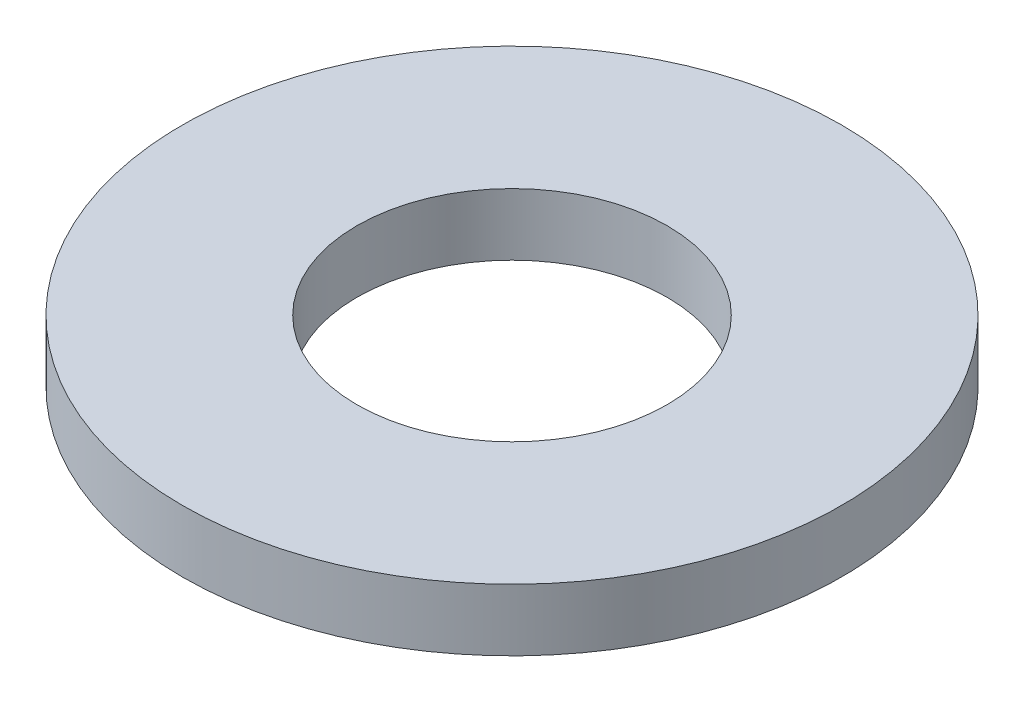
ISO-10303-21;
HEADER;
FILE_DESCRIPTION(('STEP AP214'),'2;1');
FILE_NAME('part.step','',(''),(''),'','','');
FILE_SCHEMA(('AUTOMOTIVE_DESIGN { 1 0 10303 214 1 1 1 1 }'));
ENDSEC;
DATA;
#1=APPLICATION_CONTEXT('core data for automotive mechanical design processes');
#2=APPLICATION_PROTOCOL_DEFINITION('international standard','automotive_design',2000,#1);
#3=PRODUCT_CONTEXT('',#1,'mechanical');
#4=PRODUCT('Part','Part','',(#3));
#5=PRODUCT_RELATED_PRODUCT_CATEGORY('part','',(#4));
#6=PRODUCT_DEFINITION_FORMATION('','',#4);
#7=PRODUCT_DEFINITION_CONTEXT('part definition',#1,'design');
#8=PRODUCT_DEFINITION('design','',#6,#7);
#9=PRODUCT_DEFINITION_SHAPE('','',#8);
#10=(LENGTH_UNIT() NAMED_UNIT(*) SI_UNIT(.MILLI.,.METRE.));
#11=(NAMED_UNIT(*) PLANE_ANGLE_UNIT() SI_UNIT($,.RADIAN.));
#12=(NAMED_UNIT(*) SI_UNIT($,.STERADIAN.) SOLID_ANGLE_UNIT());
#13=UNCERTAINTY_MEASURE_WITH_UNIT(LENGTH_MEASURE(1.E-05),#10,'distance_accuracy_value','');
#14=(GEOMETRIC_REPRESENTATION_CONTEXT(3) GLOBAL_UNCERTAINTY_ASSIGNED_CONTEXT((#13)) GLOBAL_UNIT_ASSIGNED_CONTEXT((#10,
#11,#12)) REPRESENTATION_CONTEXT('',''));
#15=CARTESIAN_POINT('',(0.,0.,0.));
#16=DIRECTION('',(0.,0.,1.));
#17=DIRECTION('',(1.,0.,0.));
#18=AXIS2_PLACEMENT_3D('',#15,#16,#17);
#19=CARTESIAN_POINT('',(0.,0.64,0.));
#20=DIRECTION('',(0.,1.,0.));
#21=DIRECTION('',(0.,0.,-1.));
#22=AXIS2_PLACEMENT_3D('',#19,#20,#21);
#23=PLANE('',#22);
#24=CARTESIAN_POINT('',(0.,0.64,0.));
#25=DIRECTION('',(0.,-1.,0.));
#26=DIRECTION('',(0.,0.,-1.));
#27=AXIS2_PLACEMENT_3D('',#24,#25,#26);
#28=CIRCLE('',#27,3.4);
#29=CARTESIAN_POINT('',(0.,0.64,3.4));
#30=VERTEX_POINT('',#29);
#31=EDGE_CURVE('E10',#30,#30,#28,.T.);
#32=ORIENTED_EDGE('',*,*,#31,.F.);
#33=EDGE_LOOP('',(#32));
#34=FACE_BOUND('',#33,.T.);
#35=CARTESIAN_POINT('',(0.,0.64,0.));
#36=DIRECTION('',(0.,-1.,0.));
#37=DIRECTION('',(0.,0.,-1.));
#38=AXIS2_PLACEMENT_3D('',#35,#36,#37);
#39=CIRCLE('',#38,1.6);
#40=CARTESIAN_POINT('',(0.,0.64,1.6));
#41=VERTEX_POINT('',#40);
#42=EDGE_CURVE('E50',#41,#41,#39,.T.);
#43=ORIENTED_EDGE('',*,*,#42,.T.);
#44=EDGE_LOOP('',(#43));
#45=FACE_BOUND('',#44,.T.);
#46=ADVANCED_FACE('F39',(#34,#45),#23,.T.);
#47=CARTESIAN_POINT('',(0.,0.,0.));
#48=DIRECTION('',(0.,1.,0.));
#49=DIRECTION('',(0.,0.,-1.));
#50=AXIS2_PLACEMENT_3D('',#47,#48,#49);
#51=PLANE('',#50);
#52=CARTESIAN_POINT('',(0.,0.,0.));
#53=DIRECTION('',(0.,-1.,0.));
#54=DIRECTION('',(0.,0.,-1.));
#55=AXIS2_PLACEMENT_3D('',#52,#53,#54);
#56=CIRCLE('',#55,3.4);
#57=CARTESIAN_POINT('',(0.,0.,3.4));
#58=VERTEX_POINT('',#57);
#59=EDGE_CURVE('E43',#58,#58,#56,.T.);
#60=ORIENTED_EDGE('',*,*,#59,.T.);
#61=EDGE_LOOP('',(#60));
#62=FACE_BOUND('',#61,.T.);
#63=CARTESIAN_POINT('',(0.,0.,0.));
#64=DIRECTION('',(0.,-1.,0.));
#65=DIRECTION('',(0.,0.,-1.));
#66=AXIS2_PLACEMENT_3D('',#63,#64,#65);
#67=CIRCLE('',#66,1.6);
#68=CARTESIAN_POINT('',(0.,0.,1.6));
#69=VERTEX_POINT('',#68);
#70=EDGE_CURVE('E52',#69,#69,#67,.T.);
#71=ORIENTED_EDGE('',*,*,#70,.F.);
#72=EDGE_LOOP('',(#71));
#73=FACE_BOUND('',#72,.T.);
#74=ADVANCED_FACE('F65',(#62,#73),#51,.F.);
#75=CARTESIAN_POINT('',(0.,0.64,0.));
#76=DIRECTION('',(0.,-1.,0.));
#77=DIRECTION('',(0.,0.,1.));
#78=AXIS2_PLACEMENT_3D('',#75,#76,#77);
#79=CYLINDRICAL_SURFACE('',#78,3.4);
#80=CARTESIAN_POINT('',(0.,0.64,3.4));
#81=CARTESIAN_POINT('',(0.,0.633333333333334,3.4));
#82=CARTESIAN_POINT('',(0.,0.626666666666667,3.4));
#83=CARTESIAN_POINT('',(0.,0.613333333333334,3.4));
#84=CARTESIAN_POINT('',(0.,0.606666666666667,3.4));
#85=CARTESIAN_POINT('',(0.,0.593333333333333,3.4));
#86=CARTESIAN_POINT('',(0.,0.586666666666667,3.4));
#87=CARTESIAN_POINT('',(0.,0.573333333333333,3.4));
#88=CARTESIAN_POINT('',(0.,0.566666666666667,3.4));
#89=CARTESIAN_POINT('',(0.,0.553333333333333,3.4));
#90=CARTESIAN_POINT('',(0.,0.546666666666667,3.4));
#91=CARTESIAN_POINT('',(0.,0.533333333333333,3.4));
#92=CARTESIAN_POINT('',(0.,0.526666666666667,3.4));
#93=CARTESIAN_POINT('',(0.,0.513333333333333,3.4));
#94=CARTESIAN_POINT('',(0.,0.506666666666667,3.4));
#95=CARTESIAN_POINT('',(0.,0.493333333333333,3.4));
#96=CARTESIAN_POINT('',(0.,0.486666666666667,3.4));
#97=CARTESIAN_POINT('',(0.,0.473333333333333,3.4));
#98=CARTESIAN_POINT('',(0.,0.466666666666667,3.4));
#99=CARTESIAN_POINT('',(0.,0.453333333333333,3.4));
#100=CARTESIAN_POINT('',(0.,0.446666666666667,3.4));
#101=CARTESIAN_POINT('',(0.,0.433333333333333,3.4));
#102=CARTESIAN_POINT('',(0.,0.426666666666667,3.4));
#103=CARTESIAN_POINT('',(0.,0.413333333333333,3.4));
#104=CARTESIAN_POINT('',(0.,0.406666666666667,3.4));
#105=CARTESIAN_POINT('',(0.,0.393333333333333,3.4));
#106=CARTESIAN_POINT('',(0.,0.386666666666667,3.4));
#107=CARTESIAN_POINT('',(0.,0.373333333333333,3.4));
#108=CARTESIAN_POINT('',(0.,0.366666666666667,3.4));
#109=CARTESIAN_POINT('',(0.,0.353333333333333,3.4));
#110=CARTESIAN_POINT('',(0.,0.346666666666667,3.4));
#111=CARTESIAN_POINT('',(0.,0.333333333333333,3.4));
#112=CARTESIAN_POINT('',(0.,0.326666666666667,3.4));
#113=CARTESIAN_POINT('',(0.,0.313333333333333,3.4));
#114=CARTESIAN_POINT('',(0.,0.306666666666667,3.4));
#115=CARTESIAN_POINT('',(0.,0.293333333333333,3.4));
#116=CARTESIAN_POINT('',(0.,0.286666666666667,3.4));
#117=CARTESIAN_POINT('',(0.,0.273333333333333,3.4));
#118=CARTESIAN_POINT('',(0.,0.266666666666667,3.4));
#119=CARTESIAN_POINT('',(0.,0.253333333333333,3.4));
#120=CARTESIAN_POINT('',(0.,0.246666666666667,3.4));
#121=CARTESIAN_POINT('',(0.,0.233333333333333,3.4));
#122=CARTESIAN_POINT('',(0.,0.226666666666667,3.4));
#123=CARTESIAN_POINT('',(0.,0.213333333333333,3.4));
#124=CARTESIAN_POINT('',(0.,0.206666666666667,3.4));
#125=CARTESIAN_POINT('',(0.,0.193333333333333,3.4));
#126=CARTESIAN_POINT('',(0.,0.186666666666667,3.4));
#127=CARTESIAN_POINT('',(0.,0.173333333333333,3.4));
#128=CARTESIAN_POINT('',(0.,0.166666666666667,3.4));
#129=CARTESIAN_POINT('',(0.,0.153333333333333,3.4));
#130=CARTESIAN_POINT('',(0.,0.146666666666667,3.4));
#131=CARTESIAN_POINT('',(0.,0.133333333333333,3.4));
#132=CARTESIAN_POINT('',(0.,0.126666666666667,3.4));
#133=CARTESIAN_POINT('',(0.,0.113333333333333,3.4));
#134=CARTESIAN_POINT('',(0.,0.106666666666667,3.4));
#135=CARTESIAN_POINT('',(0.,0.0933333333333334,3.4));
#136=CARTESIAN_POINT('',(0.,0.0866666666666667,3.4));
#137=CARTESIAN_POINT('',(0.,0.0733333333333333,3.4));
#138=CARTESIAN_POINT('',(0.,0.0666666666666667,3.4));
#139=CARTESIAN_POINT('',(0.,0.0533333333333334,3.4));
#140=CARTESIAN_POINT('',(0.,0.0466666666666667,3.4));
#141=CARTESIAN_POINT('',(0.,0.0333333333333333,3.4));
#142=CARTESIAN_POINT('',(0.,0.0266666666666667,3.4));
#143=CARTESIAN_POINT('',(0.,0.0133333333333334,3.4));
#144=CARTESIAN_POINT('',(0.,0.00666666666666668,3.4));
#145=CARTESIAN_POINT('',(0.,0.,3.4));
#146=B_SPLINE_CURVE_WITH_KNOTS('',3,(#80,#81,#82,#83,#84,#85,#86,#87,#88,#89,#90,#91,#92,#93,
#94,#95,#96,#97,#98,#99,#100,#101,#102,#103,#104,#105,#106,#107,#108,#109,#110,#111,#112,#113,
#114,#115,#116,#117,#118,#119,#120,#121,#122,#123,#124,#125,#126,#127,#128,#129,#130,#131,#132,
#133,#134,#135,#136,#137,#138,#139,#140,#141,#142,#143,#144,#145),.UNSPECIFIED.,.F.,.F.,(4,2,2,
2,2,2,2,2,2,2,2,2,2,2,2,2,2,2,2,2,2,2,2,2,2,2,2,2,2,2,2,2,4),(0.,0.0200000000000001,
0.0400000000000001,0.06,0.0800000000000001,0.1,0.12,0.14,0.16,0.18,0.2,0.22,0.24,0.26,0.28,0.3,
0.32,0.34,0.36,0.38,0.4,0.42,0.44,0.46,0.48,0.5,0.52,0.54,0.56,0.58,0.6,0.62,0.64),.UNSPECIFIED.);
#147=EDGE_CURVE('BSEAM41',#30,#58,#146,.T.);
#148=ORIENTED_EDGE('',*,*,#31,.T.);
#149=ORIENTED_EDGE('',*,*,#59,.F.);
#150=ORIENTED_EDGE('',*,*,#147,.T.);
#151=ORIENTED_EDGE('',*,*,#147,.F.);
#152=EDGE_LOOP('',(#148,#150,#149,#151));
#153=FACE_BOUND('',#152,.T.);
#154=ADVANCED_FACE('F41',(#153),#79,.T.);
#155=CARTESIAN_POINT('',(0.,0.64,0.));
#156=DIRECTION('',(0.,-1.,0.));
#157=DIRECTION('',(0.,0.,1.));
#158=AXIS2_PLACEMENT_3D('',#155,#156,#157);
#159=CYLINDRICAL_SURFACE('',#158,1.6);
#160=CARTESIAN_POINT('',(0.,0.64,1.6));
#161=CARTESIAN_POINT('',(0.,0.633333333333334,1.6));
#162=CARTESIAN_POINT('',(0.,0.626666666666667,1.6));
#163=CARTESIAN_POINT('',(0.,0.613333333333334,1.6));
#164=CARTESIAN_POINT('',(0.,0.606666666666667,1.6));
#165=CARTESIAN_POINT('',(0.,0.593333333333333,1.6));
#166=CARTESIAN_POINT('',(0.,0.586666666666667,1.6));
#167=CARTESIAN_POINT('',(0.,0.573333333333333,1.6));
#168=CARTESIAN_POINT('',(0.,0.566666666666667,1.6));
#169=CARTESIAN_POINT('',(0.,0.553333333333333,1.6));
#170=CARTESIAN_POINT('',(0.,0.546666666666667,1.6));
#171=CARTESIAN_POINT('',(0.,0.533333333333333,1.6));
#172=CARTESIAN_POINT('',(0.,0.526666666666667,1.6));
#173=CARTESIAN_POINT('',(0.,0.513333333333333,1.6));
#174=CARTESIAN_POINT('',(0.,0.506666666666667,1.6));
#175=CARTESIAN_POINT('',(0.,0.493333333333333,1.6));
#176=CARTESIAN_POINT('',(0.,0.486666666666667,1.6));
#177=CARTESIAN_POINT('',(0.,0.473333333333333,1.6));
#178=CARTESIAN_POINT('',(0.,0.466666666666667,1.6));
#179=CARTESIAN_POINT('',(0.,0.453333333333333,1.6));
#180=CARTESIAN_POINT('',(0.,0.446666666666667,1.6));
#181=CARTESIAN_POINT('',(0.,0.433333333333333,1.6));
#182=CARTESIAN_POINT('',(0.,0.426666666666667,1.6));
#183=CARTESIAN_POINT('',(0.,0.413333333333333,1.6));
#184=CARTESIAN_POINT('',(0.,0.406666666666667,1.6));
#185=CARTESIAN_POINT('',(0.,0.393333333333333,1.6));
#186=CARTESIAN_POINT('',(0.,0.386666666666667,1.6));
#187=CARTESIAN_POINT('',(0.,0.373333333333333,1.6));
#188=CARTESIAN_POINT('',(0.,0.366666666666667,1.6));
#189=CARTESIAN_POINT('',(0.,0.353333333333333,1.6));
#190=CARTESIAN_POINT('',(0.,0.346666666666667,1.6));
#191=CARTESIAN_POINT('',(0.,0.333333333333333,1.6));
#192=CARTESIAN_POINT('',(0.,0.326666666666667,1.6));
#193=CARTESIAN_POINT('',(0.,0.313333333333333,1.6));
#194=CARTESIAN_POINT('',(0.,0.306666666666667,1.6));
#195=CARTESIAN_POINT('',(0.,0.293333333333333,1.6));
#196=CARTESIAN_POINT('',(0.,0.286666666666667,1.6));
#197=CARTESIAN_POINT('',(0.,0.273333333333333,1.6));
#198=CARTESIAN_POINT('',(0.,0.266666666666667,1.6));
#199=CARTESIAN_POINT('',(0.,0.253333333333333,1.6));
#200=CARTESIAN_POINT('',(0.,0.246666666666667,1.6));
#201=CARTESIAN_POINT('',(0.,0.233333333333333,1.6));
#202=CARTESIAN_POINT('',(0.,0.226666666666667,1.6));
#203=CARTESIAN_POINT('',(0.,0.213333333333333,1.6));
#204=CARTESIAN_POINT('',(0.,0.206666666666667,1.6));
#205=CARTESIAN_POINT('',(0.,0.193333333333333,1.6));
#206=CARTESIAN_POINT('',(0.,0.186666666666667,1.6));
#207=CARTESIAN_POINT('',(0.,0.173333333333333,1.6));
#208=CARTESIAN_POINT('',(0.,0.166666666666667,1.6));
#209=CARTESIAN_POINT('',(0.,0.153333333333333,1.6));
#210=CARTESIAN_POINT('',(0.,0.146666666666667,1.6));
#211=CARTESIAN_POINT('',(0.,0.133333333333333,1.6));
#212=CARTESIAN_POINT('',(0.,0.126666666666667,1.6));
#213=CARTESIAN_POINT('',(0.,0.113333333333333,1.6));
#214=CARTESIAN_POINT('',(0.,0.106666666666667,1.6));
#215=CARTESIAN_POINT('',(0.,0.0933333333333334,1.6));
#216=CARTESIAN_POINT('',(0.,0.0866666666666667,1.6));
#217=CARTESIAN_POINT('',(0.,0.0733333333333333,1.6));
#218=CARTESIAN_POINT('',(0.,0.0666666666666667,1.6));
#219=CARTESIAN_POINT('',(0.,0.0533333333333334,1.6));
#220=CARTESIAN_POINT('',(0.,0.0466666666666667,1.6));
#221=CARTESIAN_POINT('',(0.,0.0333333333333333,1.6));
#222=CARTESIAN_POINT('',(0.,0.0266666666666667,1.6));
#223=CARTESIAN_POINT('',(0.,0.0133333333333334,1.6));
#224=CARTESIAN_POINT('',(0.,0.00666666666666668,1.6));
#225=CARTESIAN_POINT('',(0.,0.,1.6));
#226=B_SPLINE_CURVE_WITH_KNOTS('',3,(#160,#161,#162,#163,#164,#165,#166,#167,#168,#169,#170,
#171,#172,#173,#174,#175,#176,#177,#178,#179,#180,#181,#182,#183,#184,#185,#186,#187,#188,#189,
#190,#191,#192,#193,#194,#195,#196,#197,#198,#199,#200,#201,#202,#203,#204,#205,#206,#207,#208,
#209,#210,#211,#212,#213,#214,#215,#216,#217,#218,#219,#220,#221,#222,#223,#224,#225),
.UNSPECIFIED.,.F.,.F.,(4,2,2,2,2,2,2,2,2,2,2,2,2,2,2,2,2,2,2,2,2,2,2,2,2,2,2,2,2,2,2,2,4),(0.,
0.0200000000000001,0.0400000000000001,0.06,0.0800000000000001,0.1,0.12,0.14,0.16,0.18,0.2,0.22,
0.24,0.26,0.28,0.3,0.32,0.34,0.36,0.38,0.4,0.42,0.44,0.46,0.48,0.5,0.52,0.54,0.56,0.58,0.6,0.62,
0.64),.UNSPECIFIED.);
#227=EDGE_CURVE('BSEAM59',#41,#69,#226,.T.);
#228=ORIENTED_EDGE('',*,*,#42,.F.);
#229=ORIENTED_EDGE('',*,*,#70,.T.);
#230=ORIENTED_EDGE('',*,*,#227,.T.);
#231=ORIENTED_EDGE('',*,*,#227,.F.);
#232=EDGE_LOOP('',(#228,#230,#229,#231));
#233=FACE_BOUND('',#232,.T.);
#234=ADVANCED_FACE('F59',(#233),#159,.F.);
#235=CLOSED_SHELL('',(#46,#74,#154,#234));
#236=MANIFOLD_SOLID_BREP('B2',#235);
#237=ADVANCED_BREP_SHAPE_REPRESENTATION('',(#18,#236),#14);
#238=SHAPE_DEFINITION_REPRESENTATION(#9,#237);
ENDSEC;
END-ISO-10303-21;
